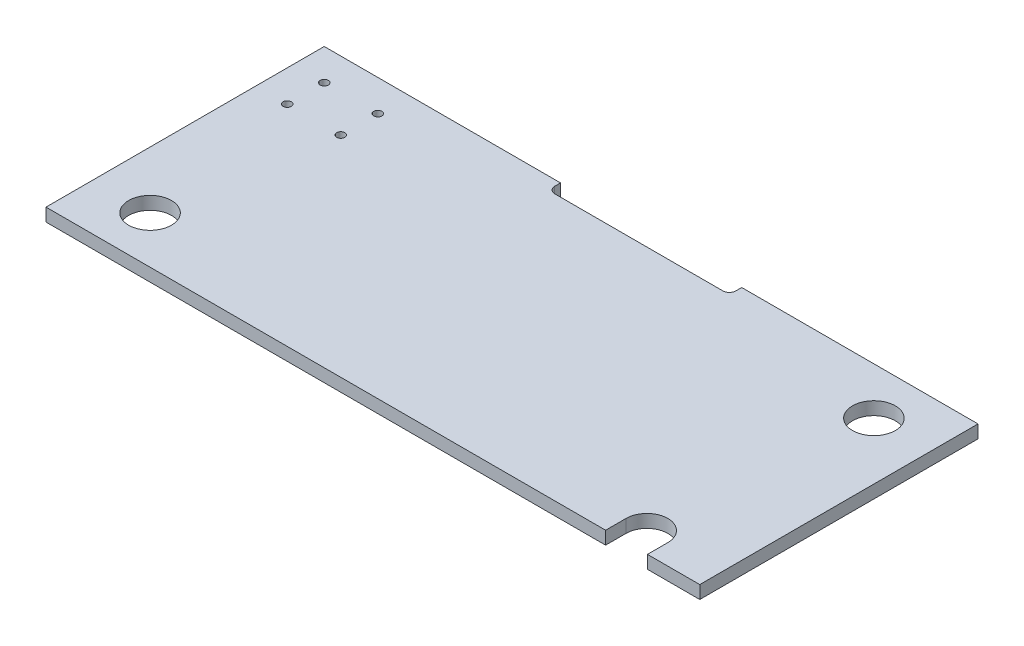
ISO-10303-21;
HEADER;
FILE_DESCRIPTION(('STEP AP214'),'2;1');
FILE_NAME('part.step','',(''),(''),'','','');
FILE_SCHEMA(('AUTOMOTIVE_DESIGN { 1 0 10303 214 1 1 1 1 }'));
ENDSEC;
DATA;
#1=APPLICATION_CONTEXT('core data for automotive mechanical design processes');
#2=APPLICATION_PROTOCOL_DEFINITION('international standard','automotive_design',2000,#1);
#3=PRODUCT_CONTEXT('',#1,'mechanical');
#4=PRODUCT('Part','Part','',(#3));
#5=PRODUCT_RELATED_PRODUCT_CATEGORY('part','',(#4));
#6=PRODUCT_DEFINITION_FORMATION('','',#4);
#7=PRODUCT_DEFINITION_CONTEXT('part definition',#1,'design');
#8=PRODUCT_DEFINITION('design','',#6,#7);
#9=PRODUCT_DEFINITION_SHAPE('','',#8);
#10=(LENGTH_UNIT() NAMED_UNIT(*) SI_UNIT(.MILLI.,.METRE.));
#11=(NAMED_UNIT(*) PLANE_ANGLE_UNIT() SI_UNIT($,.RADIAN.));
#12=(NAMED_UNIT(*) SI_UNIT($,.STERADIAN.) SOLID_ANGLE_UNIT());
#13=UNCERTAINTY_MEASURE_WITH_UNIT(LENGTH_MEASURE(1.E-05),#10,'distance_accuracy_value','');
#14=(GEOMETRIC_REPRESENTATION_CONTEXT(3) GLOBAL_UNCERTAINTY_ASSIGNED_CONTEXT((#13)) GLOBAL_UNIT_ASSIGNED_CONTEXT((#10,
#11,#12)) REPRESENTATION_CONTEXT('',''));
#15=CARTESIAN_POINT('',(0.,0.,0.));
#16=DIRECTION('',(0.,0.,1.));
#17=DIRECTION('',(1.,0.,0.));
#18=AXIS2_PLACEMENT_3D('',#15,#16,#17);
#19=CARTESIAN_POINT('',(10.9999999999992,0.,-15.3910000000009));
#20=DIRECTION('',(1.,0.,0.));
#21=DIRECTION('',(0.,0.,-1.));
#22=AXIS2_PLACEMENT_3D('',#19,#20,#21);
#23=PLANE('',#22);
#24=DIRECTION('',(0.,0.,1.));
#25=VECTOR('',#24,1.);
#26=CARTESIAN_POINT('',(10.9999999999992,-1.5748,16.891));
#27=LINE('',#26,#25);
#28=CARTESIAN_POINT('',(10.9999999999992,-1.5748,-16.891));
#29=VERTEX_POINT('',#28);
#30=CARTESIAN_POINT('',(10.9999999999992,-1.5748,-16.1847500000009));
#31=VERTEX_POINT('',#30);
#32=EDGE_CURVE('E292',#29,#31,#27,.T.);
#33=ORIENTED_EDGE('',*,*,#32,.T.);
#34=DIRECTION('',(0.,-1.,0.));
#35=VECTOR('',#34,1.);
#36=CARTESIAN_POINT('',(10.9999999999992,0.,-16.1847500000009));
#37=LINE('',#36,#35);
#38=CARTESIAN_POINT('',(10.9999999999992,0.,-16.1847500000009));
#39=VERTEX_POINT('',#38);
#40=EDGE_CURVE('E239',#31,#39,#37,.F.);
#41=ORIENTED_EDGE('',*,*,#40,.T.);
#42=DIRECTION('',(0.,0.,-1.));
#43=VECTOR('',#42,1.);
#44=CARTESIAN_POINT('',(10.9999999999992,0.,-15.3910000000009));
#45=LINE('',#44,#43);
#46=CARTESIAN_POINT('',(10.9999999999992,0.,-16.891));
#47=VERTEX_POINT('',#46);
#48=EDGE_CURVE('E110',#47,#39,#45,.F.);
#49=ORIENTED_EDGE('',*,*,#48,.F.);
#50=DIRECTION('',(0.,1.,0.));
#51=VECTOR('',#50,1.);
#52=CARTESIAN_POINT('',(10.9999999999992,-1.5748,-16.891));
#53=LINE('',#52,#51);
#54=EDGE_CURVE('E146',#29,#47,#53,.T.);
#55=ORIENTED_EDGE('',*,*,#54,.F.);
#56=EDGE_LOOP('',(#33,#41,#49,#55));
#57=FACE_BOUND('',#56,.T.);
#58=ADVANCED_FACE('F17',(#57),#23,.F.);
#59=CARTESIAN_POINT('',(-10.9999999999992,0.,-16.891));
#60=DIRECTION('',(-1.,0.,0.));
#61=DIRECTION('',(0.,0.,1.));
#62=AXIS2_PLACEMENT_3D('',#59,#60,#61);
#63=PLANE('',#62);
#64=DIRECTION('',(0.,0.,1.));
#65=VECTOR('',#64,1.);
#66=CARTESIAN_POINT('',(-10.9999999999992,0.,-16.891));
#67=LINE('',#66,#65);
#68=CARTESIAN_POINT('',(-10.9999999999992,0.,-16.1847500000009));
#69=VERTEX_POINT('',#68);
#70=CARTESIAN_POINT('',(-10.9999999999992,0.,-16.891));
#71=VERTEX_POINT('',#70);
#72=EDGE_CURVE('E35',#69,#71,#67,.F.);
#73=ORIENTED_EDGE('',*,*,#72,.F.);
#74=DIRECTION('',(0.,-1.,0.));
#75=VECTOR('',#74,1.);
#76=CARTESIAN_POINT('',(-10.9999999999992,0.,-16.1847500000009));
#77=LINE('',#76,#75);
#78=CARTESIAN_POINT('',(-10.9999999999992,-1.5748,-16.1847500000009));
#79=VERTEX_POINT('',#78);
#80=EDGE_CURVE('E237',#69,#79,#77,.T.);
#81=ORIENTED_EDGE('',*,*,#80,.T.);
#82=DIRECTION('',(0.,0.,1.));
#83=VECTOR('',#82,1.);
#84=CARTESIAN_POINT('',(-10.9999999999992,-1.5748,16.891));
#85=LINE('',#84,#83);
#86=CARTESIAN_POINT('',(-10.9999999999992,-1.5748,-16.891));
#87=VERTEX_POINT('',#86);
#88=EDGE_CURVE('E288',#79,#87,#85,.F.);
#89=ORIENTED_EDGE('',*,*,#88,.T.);
#90=DIRECTION('',(0.,1.,0.));
#91=VECTOR('',#90,1.);
#92=CARTESIAN_POINT('',(-10.9999999999992,-1.5748,-16.891));
#93=LINE('',#92,#91);
#94=EDGE_CURVE('E175',#71,#87,#93,.F.);
#95=ORIENTED_EDGE('',*,*,#94,.F.);
#96=EDGE_LOOP('',(#73,#81,#89,#95));
#97=FACE_BOUND('',#96,.T.);
#98=ADVANCED_FACE('F314',(#97),#63,.F.);
#99=CARTESIAN_POINT('',(-39.6875,-1.5748,16.891));
#100=DIRECTION('',(0.,1.,0.));
#101=DIRECTION('',(0.,0.,1.));
#102=AXIS2_PLACEMENT_3D('',#99,#100,#101);
#103=PLANE('',#102);
#104=CARTESIAN_POINT('',(-29.3751,-1.5748,-8.5852));
#105=DIRECTION('',(0.,1.,0.));
#106=DIRECTION('',(0.,0.,1.));
#107=AXIS2_PLACEMENT_3D('',#104,#105,#106);
#108=CIRCLE('',#107,0.495300000000001);
#109=CARTESIAN_POINT('',(-29.3751,-1.5748,-8.0899));
#110=VERTEX_POINT('',#109);
#111=EDGE_CURVE('E216',#110,#110,#108,.T.);
#112=ORIENTED_EDGE('',*,*,#111,.T.);
#113=EDGE_LOOP('',(#112));
#114=FACE_BOUND('',#113,.T.);
#115=CARTESIAN_POINT('',(-35.8775,-1.5748,-8.5852));
#116=DIRECTION('',(0.,1.,0.));
#117=DIRECTION('',(0.,0.,1.));
#118=AXIS2_PLACEMENT_3D('',#115,#116,#117);
#119=CIRCLE('',#118,0.495300000000001);
#120=CARTESIAN_POINT('',(-35.8775,-1.5748,-8.0899));
#121=VERTEX_POINT('',#120);
#122=EDGE_CURVE('E220',#121,#121,#119,.T.);
#123=ORIENTED_EDGE('',*,*,#122,.T.);
#124=EDGE_LOOP('',(#123));
#125=FACE_BOUND('',#124,.T.);
#126=CARTESIAN_POINT('',(-35.8775,-1.5748,-13.081));
#127=DIRECTION('',(0.,1.,0.));
#128=DIRECTION('',(0.,0.,1.));
#129=AXIS2_PLACEMENT_3D('',#126,#127,#128);
#130=CIRCLE('',#129,0.495300000000001);
#131=CARTESIAN_POINT('',(-35.8775,-1.5748,-12.5857));
#132=VERTEX_POINT('',#131);
#133=EDGE_CURVE('E223',#132,#132,#130,.T.);
#134=ORIENTED_EDGE('',*,*,#133,.T.);
#135=EDGE_LOOP('',(#134));
#136=FACE_BOUND('',#135,.T.);
#137=CARTESIAN_POINT('',(-29.3751,-1.5748,-13.081));
#138=DIRECTION('',(0.,1.,0.));
#139=DIRECTION('',(0.,0.,1.));
#140=AXIS2_PLACEMENT_3D('',#137,#138,#139);
#141=CIRCLE('',#140,0.495300000000001);
#142=CARTESIAN_POINT('',(-29.3751,-1.5748,-12.5857));
#143=VERTEX_POINT('',#142);
#144=EDGE_CURVE('E226',#143,#143,#141,.T.);
#145=ORIENTED_EDGE('',*,*,#144,.T.);
#146=EDGE_LOOP('',(#145));
#147=FACE_BOUND('',#146,.T.);
#148=CARTESIAN_POINT('',(32.766,-1.5748,-11.176));
#149=DIRECTION('',(0.,1.,0.));
#150=DIRECTION('',(0.,0.,1.));
#151=AXIS2_PLACEMENT_3D('',#148,#149,#150);
#152=CIRCLE('',#151,2.59999999999976);
#153=CARTESIAN_POINT('',(32.766,-1.5748,-8.57600000000024));
#154=VERTEX_POINT('',#153);
#155=EDGE_CURVE('E229',#154,#154,#152,.T.);
#156=ORIENTED_EDGE('',*,*,#155,.T.);
#157=EDGE_LOOP('',(#156));
#158=FACE_BOUND('',#157,.T.);
#159=CARTESIAN_POINT('',(-32.766,-1.5748,11.176));
#160=DIRECTION('',(0.,1.,0.));
#161=DIRECTION('',(0.,0.,1.));
#162=AXIS2_PLACEMENT_3D('',#159,#160,#161);
#163=CIRCLE('',#162,2.59999999999976);
#164=CARTESIAN_POINT('',(-32.766,-1.5748,13.7759999999998));
#165=VERTEX_POINT('',#164);
#166=EDGE_CURVE('E232',#165,#165,#163,.T.);
#167=ORIENTED_EDGE('',*,*,#166,.T.);
#168=EDGE_LOOP('',(#167));
#169=FACE_BOUND('',#168,.T.);
#170=ORIENTED_EDGE('',*,*,#88,.F.);
#171=CARTESIAN_POINT('',(-10.2062499999992,-1.5748,-16.1847500000009));
#172=DIRECTION('',(0.,-1.,0.));
#173=DIRECTION('',(0.,0.,-1.));
#174=AXIS2_PLACEMENT_3D('',#171,#172,#173);
#175=CIRCLE('',#174,0.793749999999999);
#176=CARTESIAN_POINT('',(-10.2062499999992,-1.5748,-15.3910000000009));
#177=VERTEX_POINT('',#176);
#178=EDGE_CURVE('E236',#79,#177,#175,.F.);
#179=ORIENTED_EDGE('',*,*,#178,.T.);
#180=DIRECTION('',(1.,0.,0.));
#181=VECTOR('',#180,1.);
#182=CARTESIAN_POINT('',(-10.9999999999992,-1.5748,-15.3910000000009));
#183=LINE('',#182,#181);
#184=CARTESIAN_POINT('',(10.2062499999992,-1.5748,-15.3910000000009));
#185=VERTEX_POINT('',#184);
#186=EDGE_CURVE('E242',#177,#185,#183,.T.);
#187=ORIENTED_EDGE('',*,*,#186,.T.);
#188=CARTESIAN_POINT('',(10.2062499999992,-1.5748,-16.1847500000009));
#189=DIRECTION('',(0.,-1.,0.));
#190=DIRECTION('',(0.,0.,-1.));
#191=AXIS2_PLACEMENT_3D('',#188,#189,#190);
#192=CIRCLE('',#191,0.793749999999999);
#193=EDGE_CURVE('E182',#185,#31,#192,.F.);
#194=ORIENTED_EDGE('',*,*,#193,.T.);
#195=ORIENTED_EDGE('',*,*,#32,.F.);
#196=DIRECTION('',(-1.,0.,0.));
#197=VECTOR('',#196,1.);
#198=CARTESIAN_POINT('',(-39.6875,-1.5748,-16.891));
#199=LINE('',#198,#197);
#200=CARTESIAN_POINT('',(39.6875,-1.5748,-16.891));
#201=VERTEX_POINT('',#200);
#202=EDGE_CURVE('E145',#201,#29,#199,.T.);
#203=ORIENTED_EDGE('',*,*,#202,.F.);
#204=DIRECTION('',(0.,0.,-1.));
#205=VECTOR('',#204,1.);
#206=CARTESIAN_POINT('',(39.6875,-1.5748,-16.891));
#207=LINE('',#206,#205);
#208=CARTESIAN_POINT('',(39.6875,-1.5748,16.891));
#209=VERTEX_POINT('',#208);
#210=EDGE_CURVE('E140',#209,#201,#207,.T.);
#211=ORIENTED_EDGE('',*,*,#210,.F.);
#212=DIRECTION('',(1.,0.,0.));
#213=VECTOR('',#212,1.);
#214=CARTESIAN_POINT('',(-39.6875,-1.5748,16.891));
#215=LINE('',#214,#213);
#216=CARTESIAN_POINT('',(33.3375,-1.5748,16.891));
#217=VERTEX_POINT('',#216);
#218=EDGE_CURVE('E130',#217,#209,#215,.T.);
#219=ORIENTED_EDGE('',*,*,#218,.F.);
#220=DIRECTION('',(0.,0.,-1.));
#221=VECTOR('',#220,1.);
#222=CARTESIAN_POINT('',(33.3375,-1.5748,16.891));
#223=LINE('',#222,#221);
#224=CARTESIAN_POINT('',(33.3375,-1.5748,14.4145));
#225=VERTEX_POINT('',#224);
#226=EDGE_CURVE('E75',#217,#225,#223,.T.);
#227=ORIENTED_EDGE('',*,*,#226,.T.);
#228=CARTESIAN_POINT('',(30.7975,-1.5748,14.4145));
#229=DIRECTION('',(0.,1.,0.));
#230=DIRECTION('',(0.,0.,1.));
#231=AXIS2_PLACEMENT_3D('',#228,#229,#230);
#232=CIRCLE('',#231,2.54);
#233=CARTESIAN_POINT('',(28.2575,-1.5748,14.4145));
#234=VERTEX_POINT('',#233);
#235=EDGE_CURVE('E20',#225,#234,#232,.T.);
#236=ORIENTED_EDGE('',*,*,#235,.T.);
#237=DIRECTION('',(0.,0.,1.));
#238=VECTOR('',#237,1.);
#239=CARTESIAN_POINT('',(28.2575,-1.5748,14.4145));
#240=LINE('',#239,#238);
#241=CARTESIAN_POINT('',(28.2575,-1.5748,16.891));
#242=VERTEX_POINT('',#241);
#243=EDGE_CURVE('E85',#234,#242,#240,.T.);
#244=ORIENTED_EDGE('',*,*,#243,.T.);
#245=DIRECTION('',(1.,0.,0.));
#246=VECTOR('',#245,1.);
#247=CARTESIAN_POINT('',(-39.6875,-1.5748,16.891));
#248=LINE('',#247,#246);
#249=CARTESIAN_POINT('',(-39.6875,-1.5748,16.891));
#250=VERTEX_POINT('',#249);
#251=EDGE_CURVE('E161',#250,#242,#248,.T.);
#252=ORIENTED_EDGE('',*,*,#251,.F.);
#253=DIRECTION('',(0.,0.,1.));
#254=VECTOR('',#253,1.);
#255=CARTESIAN_POINT('',(-39.6875,-1.5748,-16.891));
#256=LINE('',#255,#254);
#257=CARTESIAN_POINT('',(-39.6875,-1.5748,-16.891));
#258=VERTEX_POINT('',#257);
#259=EDGE_CURVE('E168',#258,#250,#256,.T.);
#260=ORIENTED_EDGE('',*,*,#259,.F.);
#261=DIRECTION('',(-1.,0.,0.));
#262=VECTOR('',#261,1.);
#263=CARTESIAN_POINT('',(-39.6875,-1.5748,-16.891));
#264=LINE('',#263,#262);
#265=EDGE_CURVE('E173',#87,#258,#264,.T.);
#266=ORIENTED_EDGE('',*,*,#265,.F.);
#267=EDGE_LOOP('',(#170,#179,#187,#194,#195,#203,#211,#219,#227,#236,#244,#252,#260,#266));
#268=FACE_BOUND('',#267,.T.);
#269=ADVANCED_FACE('F142',(#114,#125,#136,#147,#158,#169,#268),#103,.F.);
#270=CARTESIAN_POINT('',(-39.6875,-1.5748,-16.891));
#271=DIRECTION('',(0.,0.,-1.));
#272=DIRECTION('',(-1.,0.,0.));
#273=AXIS2_PLACEMENT_3D('',#270,#271,#272);
#274=PLANE('',#273);
#275=DIRECTION('',(0.,1.,0.));
#276=VECTOR('',#275,1.);
#277=CARTESIAN_POINT('',(-39.6875,-1.5748,-16.891));
#278=LINE('',#277,#276);
#279=CARTESIAN_POINT('',(-39.6875,0.,-16.891));
#280=VERTEX_POINT('',#279);
#281=EDGE_CURVE('E170',#280,#258,#278,.F.);
#282=ORIENTED_EDGE('',*,*,#281,.F.);
#283=DIRECTION('',(1.,0.,0.));
#284=VECTOR('',#283,1.);
#285=CARTESIAN_POINT('',(-39.6875,0.,-16.891));
#286=LINE('',#285,#284);
#287=EDGE_CURVE('E219',#71,#280,#286,.F.);
#288=ORIENTED_EDGE('',*,*,#287,.F.);
#289=ORIENTED_EDGE('',*,*,#94,.T.);
#290=ORIENTED_EDGE('',*,*,#265,.T.);
#291=EDGE_LOOP('',(#282,#288,#289,#290));
#292=FACE_BOUND('',#291,.T.);
#293=ADVANCED_FACE('F387',(#292),#274,.T.);
#294=CARTESIAN_POINT('',(-39.6875,-1.5748,-16.891));
#295=DIRECTION('',(-1.,0.,0.));
#296=DIRECTION('',(0.,0.,1.));
#297=AXIS2_PLACEMENT_3D('',#294,#295,#296);
#298=PLANE('',#297);
#299=ORIENTED_EDGE('',*,*,#259,.T.);
#300=DIRECTION('',(0.,1.,0.));
#301=VECTOR('',#300,1.);
#302=CARTESIAN_POINT('',(-39.6875,-1.5748,16.891));
#303=LINE('',#302,#301);
#304=CARTESIAN_POINT('',(-39.6875,0.,16.891));
#305=VERTEX_POINT('',#304);
#306=EDGE_CURVE('E165',#305,#250,#303,.F.);
#307=ORIENTED_EDGE('',*,*,#306,.F.);
#308=DIRECTION('',(0.,0.,1.));
#309=VECTOR('',#308,1.);
#310=CARTESIAN_POINT('',(-39.6875,0.,16.891));
#311=LINE('',#310,#309);
#312=EDGE_CURVE('E267',#280,#305,#311,.T.);
#313=ORIENTED_EDGE('',*,*,#312,.F.);
#314=ORIENTED_EDGE('',*,*,#281,.T.);
#315=EDGE_LOOP('',(#299,#307,#313,#314));
#316=FACE_BOUND('',#315,.T.);
#317=ADVANCED_FACE('F383',(#316),#298,.T.);
#318=CARTESIAN_POINT('',(-39.6875,-1.5748,16.891));
#319=DIRECTION('',(0.,0.,1.));
#320=DIRECTION('',(1.,0.,0.));
#321=AXIS2_PLACEMENT_3D('',#318,#319,#320);
#322=PLANE('',#321);
#323=ORIENTED_EDGE('',*,*,#251,.T.);
#324=DIRECTION('',(0.,1.,0.));
#325=VECTOR('',#324,1.);
#326=CARTESIAN_POINT('',(28.2575,0.,16.891));
#327=LINE('',#326,#325);
#328=CARTESIAN_POINT('',(28.2575,0.,16.891));
#329=VERTEX_POINT('',#328);
#330=EDGE_CURVE('E160',#242,#329,#327,.T.);
#331=ORIENTED_EDGE('',*,*,#330,.T.);
#332=DIRECTION('',(1.,0.,0.));
#333=VECTOR('',#332,1.);
#334=CARTESIAN_POINT('',(-39.6875,0.,16.891));
#335=LINE('',#334,#333);
#336=EDGE_CURVE('E264',#305,#329,#335,.T.);
#337=ORIENTED_EDGE('',*,*,#336,.F.);
#338=ORIENTED_EDGE('',*,*,#306,.T.);
#339=EDGE_LOOP('',(#323,#331,#337,#338));
#340=FACE_BOUND('',#339,.T.);
#341=ADVANCED_FACE('F379',(#340),#322,.T.);
#342=CARTESIAN_POINT('',(28.2575,0.,14.4145));
#343=DIRECTION('',(-1.,0.,0.));
#344=DIRECTION('',(0.,0.,1.));
#345=AXIS2_PLACEMENT_3D('',#342,#343,#344);
#346=PLANE('',#345);
#347=ORIENTED_EDGE('',*,*,#243,.F.);
#348=DIRECTION('',(0.,1.,0.));
#349=VECTOR('',#348,1.);
#350=CARTESIAN_POINT('',(28.2575,-2.54,14.4145));
#351=LINE('',#350,#349);
#352=CARTESIAN_POINT('',(28.2575,0.,14.4145));
#353=VERTEX_POINT('',#352);
#354=EDGE_CURVE('E258',#234,#353,#351,.T.);
#355=ORIENTED_EDGE('',*,*,#354,.T.);
#356=DIRECTION('',(0.,0.,1.));
#357=VECTOR('',#356,1.);
#358=CARTESIAN_POINT('',(28.2575,0.,16.891));
#359=LINE('',#358,#357);
#360=EDGE_CURVE('E215',#329,#353,#359,.F.);
#361=ORIENTED_EDGE('',*,*,#360,.F.);
#362=ORIENTED_EDGE('',*,*,#330,.F.);
#363=EDGE_LOOP('',(#347,#355,#361,#362));
#364=FACE_BOUND('',#363,.T.);
#365=ADVANCED_FACE('F375',(#364),#346,.F.);
#366=CARTESIAN_POINT('',(30.7975,-2.54,14.4145));
#367=DIRECTION('',(0.,1.,0.));
#368=DIRECTION('',(0.,0.,1.));
#369=AXIS2_PLACEMENT_3D('',#366,#367,#368);
#370=CYLINDRICAL_SURFACE('',#369,2.54);
#371=ORIENTED_EDGE('',*,*,#235,.F.);
#372=DIRECTION('',(0.,1.,0.));
#373=VECTOR('',#372,1.);
#374=CARTESIAN_POINT('',(33.3375,0.,14.4145));
#375=LINE('',#374,#373);
#376=CARTESIAN_POINT('',(33.3375,0.,14.4145));
#377=VERTEX_POINT('',#376);
#378=EDGE_CURVE('E137',#225,#377,#375,.T.);
#379=ORIENTED_EDGE('',*,*,#378,.T.);
#380=CARTESIAN_POINT('',(30.7975,0.,14.4145));
#381=DIRECTION('',(0.,1.,0.));
#382=DIRECTION('',(0.,0.,1.));
#383=AXIS2_PLACEMENT_3D('',#380,#381,#382);
#384=CIRCLE('',#383,2.54);
#385=EDGE_CURVE('E211',#353,#377,#384,.F.);
#386=ORIENTED_EDGE('',*,*,#385,.F.);
#387=ORIENTED_EDGE('',*,*,#354,.F.);
#388=EDGE_LOOP('',(#371,#379,#386,#387));
#389=FACE_BOUND('',#388,.T.);
#390=ADVANCED_FACE('F371',(#389),#370,.F.);
#391=CARTESIAN_POINT('',(33.3375,0.,16.891));
#392=DIRECTION('',(1.,0.,0.));
#393=DIRECTION('',(0.,0.,-1.));
#394=AXIS2_PLACEMENT_3D('',#391,#392,#393);
#395=PLANE('',#394);
#396=ORIENTED_EDGE('',*,*,#226,.F.);
#397=DIRECTION('',(0.,1.,0.));
#398=VECTOR('',#397,1.);
#399=CARTESIAN_POINT('',(33.3375,-1.5748,16.891));
#400=LINE('',#399,#398);
#401=CARTESIAN_POINT('',(33.3375,0.,16.891));
#402=VERTEX_POINT('',#401);
#403=EDGE_CURVE('E136',#402,#217,#400,.F.);
#404=ORIENTED_EDGE('',*,*,#403,.F.);
#405=DIRECTION('',(0.,0.,1.));
#406=VECTOR('',#405,1.);
#407=CARTESIAN_POINT('',(33.3375,0.,16.891));
#408=LINE('',#407,#406);
#409=EDGE_CURVE('E214',#377,#402,#408,.T.);
#410=ORIENTED_EDGE('',*,*,#409,.F.);
#411=ORIENTED_EDGE('',*,*,#378,.F.);
#412=EDGE_LOOP('',(#396,#404,#410,#411));
#413=FACE_BOUND('',#412,.T.);
#414=ADVANCED_FACE('F368',(#413),#395,.F.);
#415=CARTESIAN_POINT('',(-39.6875,-1.5748,16.891));
#416=DIRECTION('',(0.,0.,1.));
#417=DIRECTION('',(1.,0.,0.));
#418=AXIS2_PLACEMENT_3D('',#415,#416,#417);
#419=PLANE('',#418);
#420=DIRECTION('',(1.,0.,0.));
#421=VECTOR('',#420,1.);
#422=CARTESIAN_POINT('',(-39.6875,0.,16.891));
#423=LINE('',#422,#421);
#424=CARTESIAN_POINT('',(39.6875,0.,16.891));
#425=VERTEX_POINT('',#424);
#426=EDGE_CURVE('E252',#402,#425,#423,.T.);
#427=ORIENTED_EDGE('',*,*,#426,.F.);
#428=ORIENTED_EDGE('',*,*,#403,.T.);
#429=ORIENTED_EDGE('',*,*,#218,.T.);
#430=DIRECTION('',(0.,1.,0.));
#431=VECTOR('',#430,1.);
#432=CARTESIAN_POINT('',(39.6875,-1.5748,16.891));
#433=LINE('',#432,#431);
#434=EDGE_CURVE('E135',#425,#209,#433,.F.);
#435=ORIENTED_EDGE('',*,*,#434,.F.);
#436=EDGE_LOOP('',(#427,#428,#429,#435));
#437=FACE_BOUND('',#436,.T.);
#438=ADVANCED_FACE('F133',(#437),#419,.T.);
#439=CARTESIAN_POINT('',(39.6875,-1.5748,-16.891));
#440=DIRECTION('',(1.,0.,0.));
#441=DIRECTION('',(0.,0.,-1.));
#442=AXIS2_PLACEMENT_3D('',#439,#440,#441);
#443=PLANE('',#442);
#444=ORIENTED_EDGE('',*,*,#210,.T.);
#445=DIRECTION('',(0.,1.,0.));
#446=VECTOR('',#445,1.);
#447=CARTESIAN_POINT('',(39.6875,-1.5748,-16.891));
#448=LINE('',#447,#446);
#449=CARTESIAN_POINT('',(39.6875,0.,-16.891));
#450=VERTEX_POINT('',#449);
#451=EDGE_CURVE('E119',#450,#201,#448,.F.);
#452=ORIENTED_EDGE('',*,*,#451,.F.);
#453=DIRECTION('',(0.,0.,1.));
#454=VECTOR('',#453,1.);
#455=CARTESIAN_POINT('',(39.6875,0.,16.891));
#456=LINE('',#455,#454);
#457=EDGE_CURVE('E150',#425,#450,#456,.F.);
#458=ORIENTED_EDGE('',*,*,#457,.F.);
#459=ORIENTED_EDGE('',*,*,#434,.T.);
#460=EDGE_LOOP('',(#444,#452,#458,#459));
#461=FACE_BOUND('',#460,.T.);
#462=ADVANCED_FACE('F148',(#461),#443,.T.);
#463=CARTESIAN_POINT('',(-39.6875,-1.5748,-16.891));
#464=DIRECTION('',(0.,0.,-1.));
#465=DIRECTION('',(-1.,0.,0.));
#466=AXIS2_PLACEMENT_3D('',#463,#464,#465);
#467=PLANE('',#466);
#468=ORIENTED_EDGE('',*,*,#451,.T.);
#469=ORIENTED_EDGE('',*,*,#202,.T.);
#470=ORIENTED_EDGE('',*,*,#54,.T.);
#471=DIRECTION('',(1.,0.,0.));
#472=VECTOR('',#471,1.);
#473=CARTESIAN_POINT('',(-39.6875,0.,-16.891));
#474=LINE('',#473,#472);
#475=EDGE_CURVE('E185',#450,#47,#474,.F.);
#476=ORIENTED_EDGE('',*,*,#475,.F.);
#477=EDGE_LOOP('',(#468,#469,#470,#476));
#478=FACE_BOUND('',#477,.T.);
#479=ADVANCED_FACE('F312',(#478),#467,.T.);
#480=CARTESIAN_POINT('',(10.2062499999992,0.,-16.1847500000009));
#481=DIRECTION('',(0.,-1.,0.));
#482=DIRECTION('',(0.,0.,-1.));
#483=AXIS2_PLACEMENT_3D('',#480,#481,#482);
#484=CYLINDRICAL_SURFACE('',#483,0.793749999999999);
#485=ORIENTED_EDGE('',*,*,#193,.F.);
#486=DIRECTION('',(0.,1.,0.));
#487=VECTOR('',#486,1.);
#488=CARTESIAN_POINT('',(10.2062499999992,0.,-15.3910000000009));
#489=LINE('',#488,#487);
#490=CARTESIAN_POINT('',(10.2062499999992,0.,-15.3910000000009));
#491=VERTEX_POINT('',#490);
#492=EDGE_CURVE('E245',#185,#491,#489,.T.);
#493=ORIENTED_EDGE('',*,*,#492,.T.);
#494=CARTESIAN_POINT('',(10.2062499999992,0.,-16.1847500000009));
#495=DIRECTION('',(0.,-1.,0.));
#496=DIRECTION('',(0.,0.,-1.));
#497=AXIS2_PLACEMENT_3D('',#494,#495,#496);
#498=CIRCLE('',#497,0.793749999999999);
#499=EDGE_CURVE('E188',#39,#491,#498,.T.);
#500=ORIENTED_EDGE('',*,*,#499,.F.);
#501=ORIENTED_EDGE('',*,*,#40,.F.);
#502=EDGE_LOOP('',(#485,#493,#500,#501));
#503=FACE_BOUND('',#502,.T.);
#504=ADVANCED_FACE('F357',(#503),#484,.F.);
#505=CARTESIAN_POINT('',(-10.9999999999992,0.,-15.3910000000009));
#506=DIRECTION('',(0.,0.,1.));
#507=DIRECTION('',(1.,0.,0.));
#508=AXIS2_PLACEMENT_3D('',#505,#506,#507);
#509=PLANE('',#508);
#510=ORIENTED_EDGE('',*,*,#186,.F.);
#511=DIRECTION('',(0.,-1.,0.));
#512=VECTOR('',#511,1.);
#513=CARTESIAN_POINT('',(-10.2062499999992,0.,-15.3910000000009));
#514=LINE('',#513,#512);
#515=CARTESIAN_POINT('',(-10.2062499999992,0.,-15.3910000000009));
#516=VERTEX_POINT('',#515);
#517=EDGE_CURVE('E235',#177,#516,#514,.F.);
#518=ORIENTED_EDGE('',*,*,#517,.T.);
#519=DIRECTION('',(1.,0.,0.));
#520=VECTOR('',#519,1.);
#521=CARTESIAN_POINT('',(-39.6875,0.,-15.3910000000009));
#522=LINE('',#521,#520);
#523=EDGE_CURVE('E208',#491,#516,#522,.F.);
#524=ORIENTED_EDGE('',*,*,#523,.F.);
#525=ORIENTED_EDGE('',*,*,#492,.F.);
#526=EDGE_LOOP('',(#510,#518,#524,#525));
#527=FACE_BOUND('',#526,.T.);
#528=ADVANCED_FACE('F353',(#527),#509,.F.);
#529=CARTESIAN_POINT('',(-10.2062499999992,0.,-16.1847500000009));
#530=DIRECTION('',(0.,-1.,0.));
#531=DIRECTION('',(0.,0.,-1.));
#532=AXIS2_PLACEMENT_3D('',#529,#530,#531);
#533=CYLINDRICAL_SURFACE('',#532,0.793749999999999);
#534=ORIENTED_EDGE('',*,*,#178,.F.);
#535=ORIENTED_EDGE('',*,*,#80,.F.);
#536=CARTESIAN_POINT('',(-10.2062499999992,0.,-16.1847500000009));
#537=DIRECTION('',(0.,-1.,0.));
#538=DIRECTION('',(0.,0.,-1.));
#539=AXIS2_PLACEMENT_3D('',#536,#537,#538);
#540=CIRCLE('',#539,0.793749999999999);
#541=EDGE_CURVE('E205',#516,#69,#540,.T.);
#542=ORIENTED_EDGE('',*,*,#541,.F.);
#543=ORIENTED_EDGE('',*,*,#517,.F.);
#544=EDGE_LOOP('',(#534,#535,#542,#543));
#545=FACE_BOUND('',#544,.T.);
#546=ADVANCED_FACE('F349',(#545),#533,.F.);
#547=CARTESIAN_POINT('',(-32.766,0.,11.176));
#548=DIRECTION('',(0.,1.,0.));
#549=DIRECTION('',(0.,0.,1.));
#550=AXIS2_PLACEMENT_3D('',#547,#548,#549);
#551=CYLINDRICAL_SURFACE('',#550,2.59999999999976);
#552=ORIENTED_EDGE('',*,*,#166,.F.);
#553=EDGE_LOOP('',(#552));
#554=FACE_BOUND('',#553,.T.);
#555=CARTESIAN_POINT('',(-32.766,0.,11.176));
#556=DIRECTION('',(0.,1.,0.));
#557=DIRECTION('',(0.,0.,1.));
#558=AXIS2_PLACEMENT_3D('',#555,#556,#557);
#559=CIRCLE('',#558,2.59999999999976);
#560=CARTESIAN_POINT('',(-32.766,0.,13.7759999999998));
#561=VERTEX_POINT('',#560);
#562=EDGE_CURVE('E202',#561,#561,#559,.F.);
#563=ORIENTED_EDGE('',*,*,#562,.F.);
#564=EDGE_LOOP('',(#563));
#565=FACE_BOUND('',#564,.T.);
#566=ADVANCED_FACE('F345',(#554,#565),#551,.F.);
#567=CARTESIAN_POINT('',(32.766,0.,-11.176));
#568=DIRECTION('',(0.,1.,0.));
#569=DIRECTION('',(0.,0.,1.));
#570=AXIS2_PLACEMENT_3D('',#567,#568,#569);
#571=CYLINDRICAL_SURFACE('',#570,2.59999999999976);
#572=ORIENTED_EDGE('',*,*,#155,.F.);
#573=EDGE_LOOP('',(#572));
#574=FACE_BOUND('',#573,.T.);
#575=CARTESIAN_POINT('',(32.766,0.,-11.176));
#576=DIRECTION('',(0.,1.,0.));
#577=DIRECTION('',(0.,0.,1.));
#578=AXIS2_PLACEMENT_3D('',#575,#576,#577);
#579=CIRCLE('',#578,2.59999999999976);
#580=CARTESIAN_POINT('',(32.766,0.,-8.57600000000024));
#581=VERTEX_POINT('',#580);
#582=EDGE_CURVE('E199',#581,#581,#579,.F.);
#583=ORIENTED_EDGE('',*,*,#582,.F.);
#584=EDGE_LOOP('',(#583));
#585=FACE_BOUND('',#584,.T.);
#586=ADVANCED_FACE('F341',(#574,#585),#571,.F.);
#587=CARTESIAN_POINT('',(-29.3751,-2.54,-13.081));
#588=DIRECTION('',(0.,1.,0.));
#589=DIRECTION('',(0.,0.,1.));
#590=AXIS2_PLACEMENT_3D('',#587,#588,#589);
#591=CYLINDRICAL_SURFACE('',#590,0.495300000000001);
#592=ORIENTED_EDGE('',*,*,#144,.F.);
#593=EDGE_LOOP('',(#592));
#594=FACE_BOUND('',#593,.T.);
#595=CARTESIAN_POINT('',(-29.3751,0.,-13.081));
#596=DIRECTION('',(0.,1.,0.));
#597=DIRECTION('',(0.,0.,1.));
#598=AXIS2_PLACEMENT_3D('',#595,#596,#597);
#599=CIRCLE('',#598,0.495300000000001);
#600=CARTESIAN_POINT('',(-29.3751,0.,-12.5857));
#601=VERTEX_POINT('',#600);
#602=EDGE_CURVE('E196',#601,#601,#599,.F.);
#603=ORIENTED_EDGE('',*,*,#602,.F.);
#604=EDGE_LOOP('',(#603));
#605=FACE_BOUND('',#604,.T.);
#606=ADVANCED_FACE('F337',(#594,#605),#591,.F.);
#607=CARTESIAN_POINT('',(-35.8775,-2.54,-13.081));
#608=DIRECTION('',(0.,1.,0.));
#609=DIRECTION('',(0.,0.,1.));
#610=AXIS2_PLACEMENT_3D('',#607,#608,#609);
#611=CYLINDRICAL_SURFACE('',#610,0.495300000000001);
#612=ORIENTED_EDGE('',*,*,#133,.F.);
#613=EDGE_LOOP('',(#612));
#614=FACE_BOUND('',#613,.T.);
#615=CARTESIAN_POINT('',(-35.8775,0.,-13.081));
#616=DIRECTION('',(0.,1.,0.));
#617=DIRECTION('',(0.,0.,1.));
#618=AXIS2_PLACEMENT_3D('',#615,#616,#617);
#619=CIRCLE('',#618,0.495300000000001);
#620=CARTESIAN_POINT('',(-35.8775,0.,-12.5857));
#621=VERTEX_POINT('',#620);
#622=EDGE_CURVE('E193',#621,#621,#619,.F.);
#623=ORIENTED_EDGE('',*,*,#622,.F.);
#624=EDGE_LOOP('',(#623));
#625=FACE_BOUND('',#624,.T.);
#626=ADVANCED_FACE('F333',(#614,#625),#611,.F.);
#627=CARTESIAN_POINT('',(-35.8775,-2.54,-8.5852));
#628=DIRECTION('',(0.,1.,0.));
#629=DIRECTION('',(0.,0.,1.));
#630=AXIS2_PLACEMENT_3D('',#627,#628,#629);
#631=CYLINDRICAL_SURFACE('',#630,0.495300000000001);
#632=ORIENTED_EDGE('',*,*,#122,.F.);
#633=EDGE_LOOP('',(#632));
#634=FACE_BOUND('',#633,.T.);
#635=CARTESIAN_POINT('',(-35.8775,0.,-8.5852));
#636=DIRECTION('',(0.,1.,0.));
#637=DIRECTION('',(0.,0.,1.));
#638=AXIS2_PLACEMENT_3D('',#635,#636,#637);
#639=CIRCLE('',#638,0.495300000000001);
#640=CARTESIAN_POINT('',(-35.8775,0.,-8.0899));
#641=VERTEX_POINT('',#640);
#642=EDGE_CURVE('E26',#641,#641,#639,.F.);
#643=ORIENTED_EDGE('',*,*,#642,.F.);
#644=EDGE_LOOP('',(#643));
#645=FACE_BOUND('',#644,.T.);
#646=ADVANCED_FACE('F326',(#634,#645),#631,.F.);
#647=CARTESIAN_POINT('',(-29.3751,-2.54,-8.5852));
#648=DIRECTION('',(0.,1.,0.));
#649=DIRECTION('',(0.,0.,1.));
#650=AXIS2_PLACEMENT_3D('',#647,#648,#649);
#651=CYLINDRICAL_SURFACE('',#650,0.495300000000001);
#652=ORIENTED_EDGE('',*,*,#111,.F.);
#653=EDGE_LOOP('',(#652));
#654=FACE_BOUND('',#653,.T.);
#655=CARTESIAN_POINT('',(-29.3751,0.,-8.5852));
#656=DIRECTION('',(0.,1.,0.));
#657=DIRECTION('',(0.,0.,1.));
#658=AXIS2_PLACEMENT_3D('',#655,#656,#657);
#659=CIRCLE('',#658,0.495300000000001);
#660=CARTESIAN_POINT('',(-29.3751,0.,-8.0899));
#661=VERTEX_POINT('',#660);
#662=EDGE_CURVE('E11',#661,#661,#659,.F.);
#663=ORIENTED_EDGE('',*,*,#662,.F.);
#664=EDGE_LOOP('',(#663));
#665=FACE_BOUND('',#664,.T.);
#666=ADVANCED_FACE('F320',(#654,#665),#651,.F.);
#667=CARTESIAN_POINT('',(-39.6875,0.,16.891));
#668=DIRECTION('',(0.,1.,0.));
#669=DIRECTION('',(0.,0.,1.));
#670=AXIS2_PLACEMENT_3D('',#667,#668,#669);
#671=PLANE('',#670);
#672=ORIENTED_EDGE('',*,*,#662,.T.);
#673=EDGE_LOOP('',(#672));
#674=FACE_BOUND('',#673,.T.);
#675=ORIENTED_EDGE('',*,*,#642,.T.);
#676=EDGE_LOOP('',(#675));
#677=FACE_BOUND('',#676,.T.);
#678=ORIENTED_EDGE('',*,*,#622,.T.);
#679=EDGE_LOOP('',(#678));
#680=FACE_BOUND('',#679,.T.);
#681=ORIENTED_EDGE('',*,*,#602,.T.);
#682=EDGE_LOOP('',(#681));
#683=FACE_BOUND('',#682,.T.);
#684=ORIENTED_EDGE('',*,*,#582,.T.);
#685=EDGE_LOOP('',(#684));
#686=FACE_BOUND('',#685,.T.);
#687=ORIENTED_EDGE('',*,*,#562,.T.);
#688=EDGE_LOOP('',(#687));
#689=FACE_BOUND('',#688,.T.);
#690=ORIENTED_EDGE('',*,*,#541,.T.);
#691=ORIENTED_EDGE('',*,*,#72,.T.);
#692=ORIENTED_EDGE('',*,*,#287,.T.);
#693=ORIENTED_EDGE('',*,*,#312,.T.);
#694=ORIENTED_EDGE('',*,*,#336,.T.);
#695=ORIENTED_EDGE('',*,*,#360,.T.);
#696=ORIENTED_EDGE('',*,*,#385,.T.);
#697=ORIENTED_EDGE('',*,*,#409,.T.);
#698=ORIENTED_EDGE('',*,*,#426,.T.);
#699=ORIENTED_EDGE('',*,*,#457,.T.);
#700=ORIENTED_EDGE('',*,*,#475,.T.);
#701=ORIENTED_EDGE('',*,*,#48,.T.);
#702=ORIENTED_EDGE('',*,*,#499,.T.);
#703=ORIENTED_EDGE('',*,*,#523,.T.);
#704=EDGE_LOOP('',(#690,#691,#692,#693,#694,#695,#696,#697,#698,#699,#700,#701,#702,#703));
#705=FACE_BOUND('',#704,.T.);
#706=ADVANCED_FACE('F309',(#674,#677,#680,#683,#686,#689,#705),#671,.T.);
#707=CLOSED_SHELL('',(#58,#98,#269,#293,#317,#341,#365,#390,#414,#438,#462,#479,#504,#528,#546,
#566,#586,#606,#626,#646,#666,#706));
#708=MANIFOLD_SOLID_BREP('B1',#707);
#709=ADVANCED_BREP_SHAPE_REPRESENTATION('',(#18,#708),#14);
#710=SHAPE_DEFINITION_REPRESENTATION(#9,#709);
ENDSEC;
END-ISO-10303-21;
